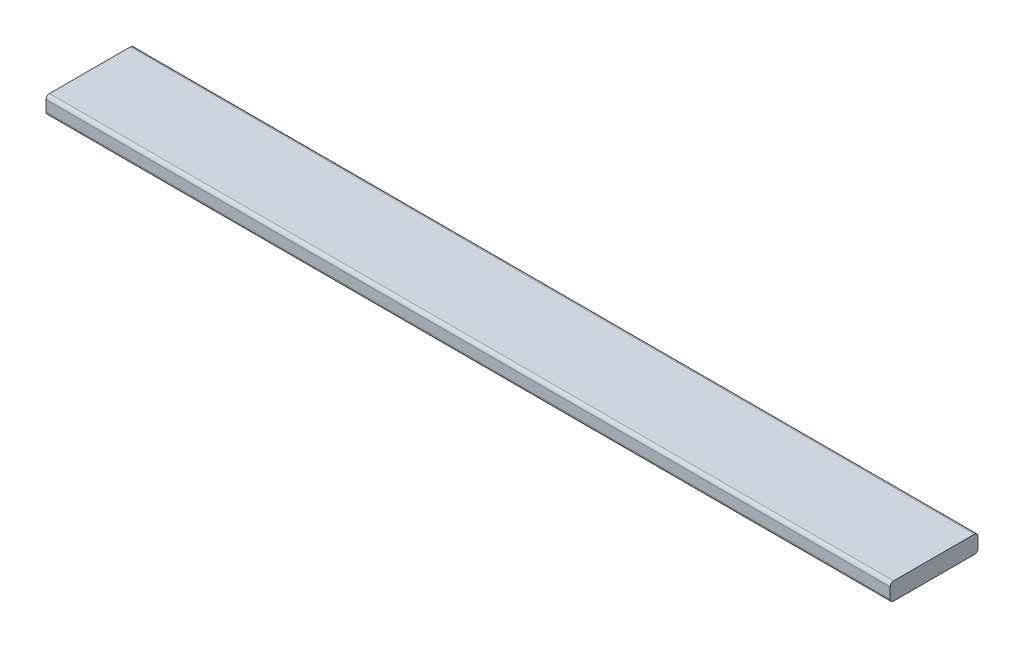
ISO-10303-21;
HEADER;
FILE_DESCRIPTION(('STEP AP214'),'2;1');
FILE_NAME('part.step','',(''),(''),'','','');
FILE_SCHEMA(('AUTOMOTIVE_DESIGN { 1 0 10303 214 1 1 1 1 }'));
ENDSEC;
DATA;
#1=APPLICATION_CONTEXT('core data for automotive mechanical design processes');
#2=APPLICATION_PROTOCOL_DEFINITION('international standard','automotive_design',2000,#1);
#3=PRODUCT_CONTEXT('',#1,'mechanical');
#4=PRODUCT('Part','Part','',(#3));
#5=PRODUCT_RELATED_PRODUCT_CATEGORY('part','',(#4));
#6=PRODUCT_DEFINITION_FORMATION('','',#4);
#7=PRODUCT_DEFINITION_CONTEXT('part definition',#1,'design');
#8=PRODUCT_DEFINITION('design','',#6,#7);
#9=PRODUCT_DEFINITION_SHAPE('','',#8);
#10=(LENGTH_UNIT() NAMED_UNIT(*) SI_UNIT(.MILLI.,.METRE.));
#11=(NAMED_UNIT(*) PLANE_ANGLE_UNIT() SI_UNIT($,.RADIAN.));
#12=(NAMED_UNIT(*) SI_UNIT($,.STERADIAN.) SOLID_ANGLE_UNIT());
#13=UNCERTAINTY_MEASURE_WITH_UNIT(LENGTH_MEASURE(1.E-05),#10,'distance_accuracy_value','');
#14=(GEOMETRIC_REPRESENTATION_CONTEXT(3) GLOBAL_UNCERTAINTY_ASSIGNED_CONTEXT((#13)) GLOBAL_UNIT_ASSIGNED_CONTEXT((#10,
#11,#12)) REPRESENTATION_CONTEXT('',''));
#15=CARTESIAN_POINT('',(0.,0.,0.));
#16=DIRECTION('',(0.,0.,1.));
#17=DIRECTION('',(1.,0.,0.));
#18=AXIS2_PLACEMENT_3D('',#15,#16,#17);
#19=CARTESIAN_POINT('',(-152.4,6.35,15.875));
#20=DIRECTION('',(1.,0.,0.));
#21=DIRECTION('',(0.,0.,-1.));
#22=AXIS2_PLACEMENT_3D('',#19,#20,#21);
#23=PLANE('',#22);
#24=DIRECTION('',(0.,-1.,0.));
#25=VECTOR('',#24,1.);
#26=CARTESIAN_POINT('',(-152.4,6.35,-15.875));
#27=LINE('',#26,#25);
#28=CARTESIAN_POINT('',(-152.4,5.08,-15.875));
#29=VERTEX_POINT('',#28);
#30=CARTESIAN_POINT('',(-152.4,1.27,-15.875));
#31=VERTEX_POINT('',#30);
#32=EDGE_CURVE('E108',#29,#31,#27,.T.);
#33=ORIENTED_EDGE('',*,*,#32,.T.);
#34=CARTESIAN_POINT('',(-152.4,1.27,-14.605));
#35=DIRECTION('',(1.,0.,0.));
#36=DIRECTION('',(0.,0.,-1.));
#37=AXIS2_PLACEMENT_3D('',#34,#35,#36);
#38=CIRCLE('',#37,1.27);
#39=CARTESIAN_POINT('',(-152.4,0.,-14.605));
#40=VERTEX_POINT('',#39);
#41=EDGE_CURVE('E116',#31,#40,#38,.F.);
#42=ORIENTED_EDGE('',*,*,#41,.T.);
#43=DIRECTION('',(0.,0.,1.));
#44=VECTOR('',#43,1.);
#45=CARTESIAN_POINT('',(-152.4,0.,15.875));
#46=LINE('',#45,#44);
#47=CARTESIAN_POINT('',(-152.4,0.,14.605));
#48=VERTEX_POINT('',#47);
#49=EDGE_CURVE('E194',#40,#48,#46,.T.);
#50=ORIENTED_EDGE('',*,*,#49,.T.);
#51=CARTESIAN_POINT('',(-152.4,1.27,14.605));
#52=DIRECTION('',(1.,0.,0.));
#53=DIRECTION('',(0.,0.,-1.));
#54=AXIS2_PLACEMENT_3D('',#51,#52,#53);
#55=CIRCLE('',#54,1.27);
#56=CARTESIAN_POINT('',(-152.4,1.27,15.875));
#57=VERTEX_POINT('',#56);
#58=EDGE_CURVE('E117',#48,#57,#55,.F.);
#59=ORIENTED_EDGE('',*,*,#58,.T.);
#60=DIRECTION('',(0.,-1.,0.));
#61=VECTOR('',#60,1.);
#62=CARTESIAN_POINT('',(-152.4,6.35,15.875));
#63=LINE('',#62,#61);
#64=CARTESIAN_POINT('',(-152.4,5.08,15.875));
#65=VERTEX_POINT('',#64);
#66=EDGE_CURVE('E135',#65,#57,#63,.T.);
#67=ORIENTED_EDGE('',*,*,#66,.F.);
#68=CARTESIAN_POINT('',(-152.4,5.08,14.605));
#69=DIRECTION('',(1.,0.,0.));
#70=DIRECTION('',(0.,0.,-1.));
#71=AXIS2_PLACEMENT_3D('',#68,#69,#70);
#72=CIRCLE('',#71,1.27);
#73=CARTESIAN_POINT('',(-152.4,6.35,14.605));
#74=VERTEX_POINT('',#73);
#75=EDGE_CURVE('E139',#65,#74,#72,.F.);
#76=ORIENTED_EDGE('',*,*,#75,.T.);
#77=DIRECTION('',(0.,0.,1.));
#78=VECTOR('',#77,1.);
#79=CARTESIAN_POINT('',(-152.4,6.35,15.875));
#80=LINE('',#79,#78);
#81=CARTESIAN_POINT('',(-152.4,6.35,-14.605));
#82=VERTEX_POINT('',#81);
#83=EDGE_CURVE('E110',#82,#74,#80,.T.);
#84=ORIENTED_EDGE('',*,*,#83,.F.);
#85=CARTESIAN_POINT('',(-152.4,5.08,-14.605));
#86=DIRECTION('',(1.,0.,0.));
#87=DIRECTION('',(0.,0.,-1.));
#88=AXIS2_PLACEMENT_3D('',#85,#86,#87);
#89=CIRCLE('',#88,1.27);
#90=EDGE_CURVE('E106',#82,#29,#89,.F.);
#91=ORIENTED_EDGE('',*,*,#90,.T.);
#92=EDGE_LOOP('',(#33,#42,#50,#59,#67,#76,#84,#91));
#93=FACE_BOUND('',#92,.T.);
#94=ADVANCED_FACE('F39',(#93),#23,.F.);
#95=CARTESIAN_POINT('',(152.4,6.35,15.875));
#96=DIRECTION('',(0.,0.,-1.));
#97=DIRECTION('',(-1.,0.,0.));
#98=AXIS2_PLACEMENT_3D('',#95,#96,#97);
#99=PLANE('',#98);
#100=ORIENTED_EDGE('',*,*,#66,.T.);
#101=DIRECTION('',(1.,0.,0.));
#102=VECTOR('',#101,1.);
#103=CARTESIAN_POINT('',(152.4,1.27,15.875));
#104=LINE('',#103,#102);
#105=CARTESIAN_POINT('',(152.4,1.27,15.875));
#106=VERTEX_POINT('',#105);
#107=EDGE_CURVE('E11',#57,#106,#104,.T.);
#108=ORIENTED_EDGE('',*,*,#107,.T.);
#109=DIRECTION('',(0.,-1.,0.));
#110=VECTOR('',#109,1.);
#111=CARTESIAN_POINT('',(152.4,6.35,15.875));
#112=LINE('',#111,#110);
#113=CARTESIAN_POINT('',(152.4,5.08,15.875));
#114=VERTEX_POINT('',#113);
#115=EDGE_CURVE('E142',#114,#106,#112,.T.);
#116=ORIENTED_EDGE('',*,*,#115,.F.);
#117=DIRECTION('',(1.,0.,0.));
#118=VECTOR('',#117,1.);
#119=CARTESIAN_POINT('',(-152.4,5.08,15.875));
#120=LINE('',#119,#118);
#121=EDGE_CURVE('E48',#114,#65,#120,.F.);
#122=ORIENTED_EDGE('',*,*,#121,.T.);
#123=EDGE_LOOP('',(#100,#108,#116,#122));
#124=FACE_BOUND('',#123,.T.);
#125=ADVANCED_FACE('F177',(#124),#99,.F.);
#126=CARTESIAN_POINT('',(152.4,6.35,15.875));
#127=DIRECTION('',(-1.,0.,0.));
#128=DIRECTION('',(0.,0.,1.));
#129=AXIS2_PLACEMENT_3D('',#126,#127,#128);
#130=PLANE('',#129);
#131=DIRECTION('',(0.,0.,-1.));
#132=VECTOR('',#131,1.);
#133=CARTESIAN_POINT('',(152.4,0.,15.875));
#134=LINE('',#133,#132);
#135=CARTESIAN_POINT('',(152.4,0.,14.605));
#136=VERTEX_POINT('',#135);
#137=CARTESIAN_POINT('',(152.4,0.,-14.605));
#138=VERTEX_POINT('',#137);
#139=EDGE_CURVE('E191',#136,#138,#134,.T.);
#140=ORIENTED_EDGE('',*,*,#139,.T.);
#141=CARTESIAN_POINT('',(152.4,1.27,-14.605));
#142=DIRECTION('',(-1.,0.,0.));
#143=DIRECTION('',(0.,0.,1.));
#144=AXIS2_PLACEMENT_3D('',#141,#142,#143);
#145=CIRCLE('',#144,1.27);
#146=CARTESIAN_POINT('',(152.4,1.27,-15.875));
#147=VERTEX_POINT('',#146);
#148=EDGE_CURVE('E164',#138,#147,#145,.F.);
#149=ORIENTED_EDGE('',*,*,#148,.T.);
#150=DIRECTION('',(0.,-1.,0.));
#151=VECTOR('',#150,1.);
#152=CARTESIAN_POINT('',(152.4,6.35,-15.875));
#153=LINE('',#152,#151);
#154=CARTESIAN_POINT('',(152.4,5.08,-15.875));
#155=VERTEX_POINT('',#154);
#156=EDGE_CURVE('E128',#155,#147,#153,.T.);
#157=ORIENTED_EDGE('',*,*,#156,.F.);
#158=CARTESIAN_POINT('',(152.4,5.08,-14.605));
#159=DIRECTION('',(-1.,0.,0.));
#160=DIRECTION('',(0.,0.,1.));
#161=AXIS2_PLACEMENT_3D('',#158,#159,#160);
#162=CIRCLE('',#161,1.27);
#163=CARTESIAN_POINT('',(152.4,6.35,-14.605));
#164=VERTEX_POINT('',#163);
#165=EDGE_CURVE('E133',#155,#164,#162,.F.);
#166=ORIENTED_EDGE('',*,*,#165,.T.);
#167=DIRECTION('',(0.,0.,-1.));
#168=VECTOR('',#167,1.);
#169=CARTESIAN_POINT('',(152.4,6.35,15.875));
#170=LINE('',#169,#168);
#171=CARTESIAN_POINT('',(152.4,6.35,14.605));
#172=VERTEX_POINT('',#171);
#173=EDGE_CURVE('E129',#172,#164,#170,.T.);
#174=ORIENTED_EDGE('',*,*,#173,.F.);
#175=CARTESIAN_POINT('',(152.4,5.08,14.605));
#176=DIRECTION('',(-1.,0.,0.));
#177=DIRECTION('',(0.,0.,1.));
#178=AXIS2_PLACEMENT_3D('',#175,#176,#177);
#179=CIRCLE('',#178,1.27);
#180=EDGE_CURVE('E62',#172,#114,#179,.F.);
#181=ORIENTED_EDGE('',*,*,#180,.T.);
#182=ORIENTED_EDGE('',*,*,#115,.T.);
#183=CARTESIAN_POINT('',(152.4,1.27,14.605));
#184=DIRECTION('',(-1.,0.,0.));
#185=DIRECTION('',(0.,0.,1.));
#186=AXIS2_PLACEMENT_3D('',#183,#184,#185);
#187=CIRCLE('',#186,1.27);
#188=EDGE_CURVE('E55',#106,#136,#187,.F.);
#189=ORIENTED_EDGE('',*,*,#188,.T.);
#190=EDGE_LOOP('',(#140,#149,#157,#166,#174,#181,#182,#189));
#191=FACE_BOUND('',#190,.T.);
#192=ADVANCED_FACE('F187',(#191),#130,.F.);
#193=CARTESIAN_POINT('',(152.4,6.35,-15.875));
#194=DIRECTION('',(0.,0.,1.));
#195=DIRECTION('',(1.,0.,0.));
#196=AXIS2_PLACEMENT_3D('',#193,#194,#195);
#197=PLANE('',#196);
#198=ORIENTED_EDGE('',*,*,#156,.T.);
#199=DIRECTION('',(-1.,0.,0.));
#200=VECTOR('',#199,1.);
#201=CARTESIAN_POINT('',(152.4,1.27,-15.875));
#202=LINE('',#201,#200);
#203=EDGE_CURVE('E126',#147,#31,#202,.T.);
#204=ORIENTED_EDGE('',*,*,#203,.T.);
#205=ORIENTED_EDGE('',*,*,#32,.F.);
#206=DIRECTION('',(-1.,0.,0.));
#207=VECTOR('',#206,1.);
#208=CARTESIAN_POINT('',(152.4,5.08,-15.875));
#209=LINE('',#208,#207);
#210=EDGE_CURVE('E123',#29,#155,#209,.F.);
#211=ORIENTED_EDGE('',*,*,#210,.T.);
#212=EDGE_LOOP('',(#198,#204,#205,#211));
#213=FACE_BOUND('',#212,.T.);
#214=ADVANCED_FACE('F122',(#213),#197,.F.);
#215=CARTESIAN_POINT('',(0.,6.35,0.));
#216=DIRECTION('',(0.,1.,0.));
#217=DIRECTION('',(0.,0.,1.));
#218=AXIS2_PLACEMENT_3D('',#215,#216,#217);
#219=PLANE('',#218);
#220=ORIENTED_EDGE('',*,*,#173,.T.);
#221=DIRECTION('',(-1.,0.,0.));
#222=VECTOR('',#221,1.);
#223=CARTESIAN_POINT('',(-152.4,6.35,-14.605));
#224=LINE('',#223,#222);
#225=EDGE_CURVE('E171',#164,#82,#224,.T.);
#226=ORIENTED_EDGE('',*,*,#225,.T.);
#227=ORIENTED_EDGE('',*,*,#83,.T.);
#228=DIRECTION('',(1.,0.,0.));
#229=VECTOR('',#228,1.);
#230=CARTESIAN_POINT('',(152.4,6.35,14.605));
#231=LINE('',#230,#229);
#232=EDGE_CURVE('E167',#74,#172,#231,.T.);
#233=ORIENTED_EDGE('',*,*,#232,.T.);
#234=EDGE_LOOP('',(#220,#226,#227,#233));
#235=FACE_BOUND('',#234,.T.);
#236=ADVANCED_FACE('F185',(#235),#219,.T.);
#237=CARTESIAN_POINT('',(0.,0.,0.));
#238=DIRECTION('',(0.,1.,0.));
#239=DIRECTION('',(0.,0.,1.));
#240=AXIS2_PLACEMENT_3D('',#237,#238,#239);
#241=PLANE('',#240);
#242=ORIENTED_EDGE('',*,*,#49,.F.);
#243=DIRECTION('',(-1.,0.,0.));
#244=VECTOR('',#243,1.);
#245=CARTESIAN_POINT('',(0.,0.,-14.605));
#246=LINE('',#245,#244);
#247=EDGE_CURVE('E155',#40,#138,#246,.F.);
#248=ORIENTED_EDGE('',*,*,#247,.T.);
#249=ORIENTED_EDGE('',*,*,#139,.F.);
#250=DIRECTION('',(1.,0.,0.));
#251=VECTOR('',#250,1.);
#252=CARTESIAN_POINT('',(0.,0.,14.605));
#253=LINE('',#252,#251);
#254=EDGE_CURVE('E152',#136,#48,#253,.F.);
#255=ORIENTED_EDGE('',*,*,#254,.T.);
#256=EDGE_LOOP('',(#242,#248,#249,#255));
#257=FACE_BOUND('',#256,.T.);
#258=ADVANCED_FACE('F205',(#257),#241,.F.);
#259=CARTESIAN_POINT('',(152.4,1.27,-14.605));
#260=DIRECTION('',(-1.,0.,0.));
#261=DIRECTION('',(0.,0.,1.));
#262=AXIS2_PLACEMENT_3D('',#259,#260,#261);
#263=CYLINDRICAL_SURFACE('',#262,1.27);
#264=ORIENTED_EDGE('',*,*,#148,.F.);
#265=ORIENTED_EDGE('',*,*,#247,.F.);
#266=ORIENTED_EDGE('',*,*,#41,.F.);
#267=ORIENTED_EDGE('',*,*,#203,.F.);
#268=EDGE_LOOP('',(#264,#265,#266,#267));
#269=FACE_BOUND('',#268,.T.);
#270=ADVANCED_FACE('F213',(#269),#263,.T.);
#271=CARTESIAN_POINT('',(0.,5.08,-14.605));
#272=DIRECTION('',(1.,0.,0.));
#273=DIRECTION('',(0.,0.,-1.));
#274=AXIS2_PLACEMENT_3D('',#271,#272,#273);
#275=CYLINDRICAL_SURFACE('',#274,1.27);
#276=ORIENTED_EDGE('',*,*,#165,.F.);
#277=ORIENTED_EDGE('',*,*,#210,.F.);
#278=ORIENTED_EDGE('',*,*,#90,.F.);
#279=ORIENTED_EDGE('',*,*,#225,.F.);
#280=EDGE_LOOP('',(#276,#277,#278,#279));
#281=FACE_BOUND('',#280,.T.);
#282=ADVANCED_FACE('F132',(#281),#275,.T.);
#283=CARTESIAN_POINT('',(152.4,1.27,14.605));
#284=DIRECTION('',(1.,0.,0.));
#285=DIRECTION('',(0.,0.,-1.));
#286=AXIS2_PLACEMENT_3D('',#283,#284,#285);
#287=CYLINDRICAL_SURFACE('',#286,1.27);
#288=ORIENTED_EDGE('',*,*,#58,.F.);
#289=ORIENTED_EDGE('',*,*,#254,.F.);
#290=ORIENTED_EDGE('',*,*,#188,.F.);
#291=ORIENTED_EDGE('',*,*,#107,.F.);
#292=EDGE_LOOP('',(#288,#289,#290,#291));
#293=FACE_BOUND('',#292,.T.);
#294=ADVANCED_FACE('F207',(#293),#287,.T.);
#295=CARTESIAN_POINT('',(0.,5.08,14.605));
#296=DIRECTION('',(-1.,0.,0.));
#297=DIRECTION('',(0.,0.,1.));
#298=AXIS2_PLACEMENT_3D('',#295,#296,#297);
#299=CYLINDRICAL_SURFACE('',#298,1.27);
#300=ORIENTED_EDGE('',*,*,#75,.F.);
#301=ORIENTED_EDGE('',*,*,#121,.F.);
#302=ORIENTED_EDGE('',*,*,#180,.F.);
#303=ORIENTED_EDGE('',*,*,#232,.F.);
#304=EDGE_LOOP('',(#300,#301,#302,#303));
#305=FACE_BOUND('',#304,.T.);
#306=ADVANCED_FACE('F41',(#305),#299,.T.);
#307=CLOSED_SHELL('',(#94,#125,#192,#214,#236,#258,#270,#282,#294,#306));
#308=MANIFOLD_SOLID_BREP('B2',#307);
#309=ADVANCED_BREP_SHAPE_REPRESENTATION('',(#18,#308),#14);
#310=SHAPE_DEFINITION_REPRESENTATION(#9,#309);
ENDSEC;
END-ISO-10303-21;
